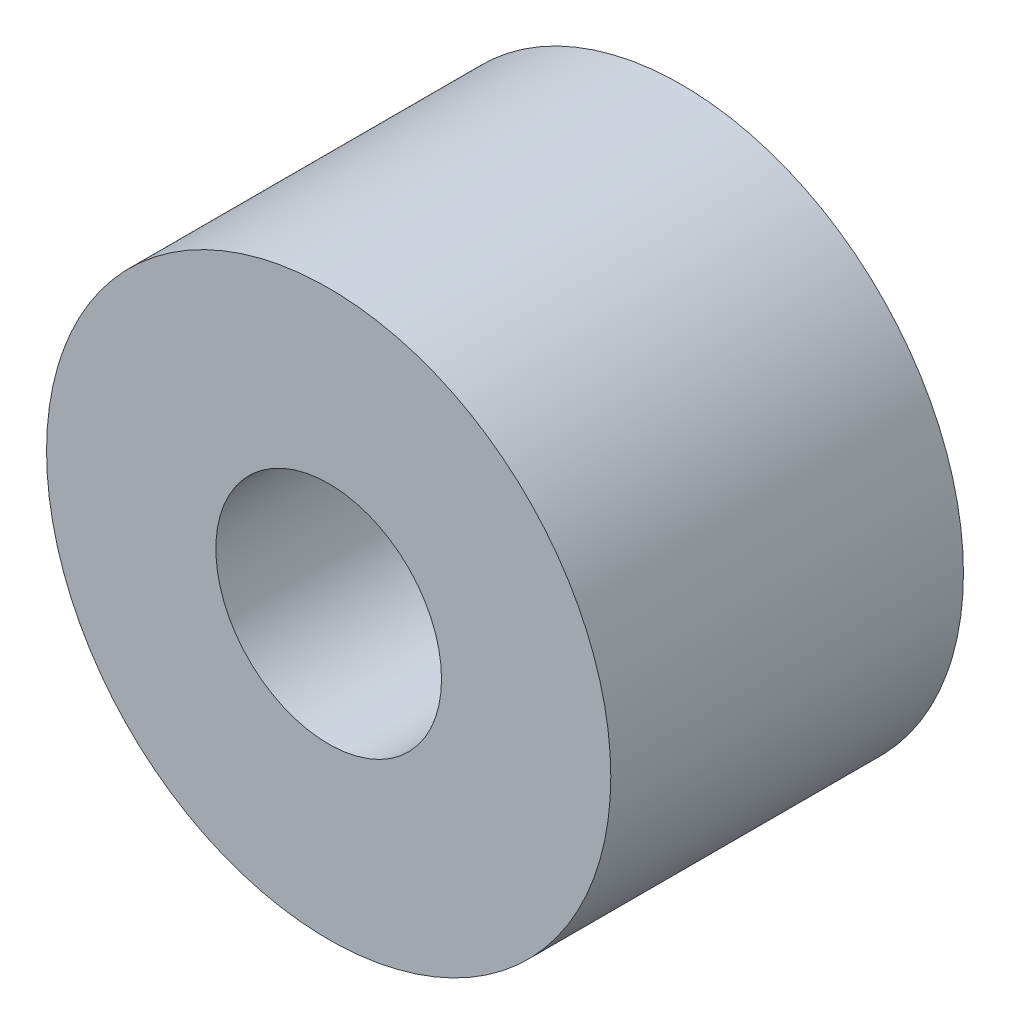
ISO-10303-21;
HEADER;
FILE_DESCRIPTION(('STEP AP214'),'2;1');
FILE_NAME('part.step','',(''),(''),'','','');
FILE_SCHEMA(('AUTOMOTIVE_DESIGN { 1 0 10303 214 1 1 1 1 }'));
ENDSEC;
DATA;
#1=APPLICATION_CONTEXT('core data for automotive mechanical design processes');
#2=APPLICATION_PROTOCOL_DEFINITION('international standard','automotive_design',2000,#1);
#3=PRODUCT_CONTEXT('',#1,'mechanical');
#4=PRODUCT('Part','Part','',(#3));
#5=PRODUCT_RELATED_PRODUCT_CATEGORY('part','',(#4));
#6=PRODUCT_DEFINITION_FORMATION('','',#4);
#7=PRODUCT_DEFINITION_CONTEXT('part definition',#1,'design');
#8=PRODUCT_DEFINITION('design','',#6,#7);
#9=PRODUCT_DEFINITION_SHAPE('','',#8);
#10=(LENGTH_UNIT() NAMED_UNIT(*) SI_UNIT(.MILLI.,.METRE.));
#11=(NAMED_UNIT(*) PLANE_ANGLE_UNIT() SI_UNIT($,.RADIAN.));
#12=(NAMED_UNIT(*) SI_UNIT($,.STERADIAN.) SOLID_ANGLE_UNIT());
#13=UNCERTAINTY_MEASURE_WITH_UNIT(LENGTH_MEASURE(1.E-05),#10,'distance_accuracy_value','');
#14=(GEOMETRIC_REPRESENTATION_CONTEXT(3) GLOBAL_UNCERTAINTY_ASSIGNED_CONTEXT((#13)) GLOBAL_UNIT_ASSIGNED_CONTEXT((#10,
#11,#12)) REPRESENTATION_CONTEXT('',''));
#15=CARTESIAN_POINT('',(0.,0.,0.));
#16=DIRECTION('',(0.,0.,1.));
#17=DIRECTION('',(1.,0.,0.));
#18=AXIS2_PLACEMENT_3D('',#15,#16,#17);
#19=CARTESIAN_POINT('',(0.,0.,2.5));
#20=DIRECTION('',(0.,0.,1.));
#21=DIRECTION('',(1.,0.,0.));
#22=AXIS2_PLACEMENT_3D('',#19,#20,#21);
#23=PLANE('',#22);
#24=CARTESIAN_POINT('',(0.,0.,2.5));
#25=DIRECTION('',(0.,0.,1.));
#26=DIRECTION('',(1.,0.,0.));
#27=AXIS2_PLACEMENT_3D('',#24,#25,#26);
#28=CIRCLE('',#27,4.);
#29=CARTESIAN_POINT('',(4.,0.,2.5));
#30=VERTEX_POINT('',#29);
#31=EDGE_CURVE('E10',#30,#30,#28,.T.);
#32=ORIENTED_EDGE('',*,*,#31,.T.);
#33=EDGE_LOOP('',(#32));
#34=FACE_BOUND('',#33,.T.);
#35=CARTESIAN_POINT('',(0.,0.,2.5));
#36=DIRECTION('',(0.,0.,1.));
#37=DIRECTION('',(1.,0.,0.));
#38=AXIS2_PLACEMENT_3D('',#35,#36,#37);
#39=CIRCLE('',#38,1.6);
#40=CARTESIAN_POINT('',(1.6,0.,2.5));
#41=VERTEX_POINT('',#40);
#42=EDGE_CURVE('E40',#41,#41,#39,.T.);
#43=ORIENTED_EDGE('',*,*,#42,.F.);
#44=EDGE_LOOP('',(#43));
#45=FACE_BOUND('',#44,.T.);
#46=ADVANCED_FACE('F33',(#34,#45),#23,.T.);
#47=CARTESIAN_POINT('',(0.,0.,2.5));
#48=DIRECTION('',(0.,0.,-1.));
#49=DIRECTION('',(-1.,0.,0.));
#50=AXIS2_PLACEMENT_3D('',#47,#48,#49);
#51=CYLINDRICAL_SURFACE('',#50,4.);
#52=ORIENTED_EDGE('',*,*,#31,.F.);
#53=EDGE_LOOP('',(#52));
#54=FACE_BOUND('',#53,.T.);
#55=CARTESIAN_POINT('',(0.,0.,-2.5));
#56=DIRECTION('',(0.,0.,1.));
#57=DIRECTION('',(1.,0.,0.));
#58=AXIS2_PLACEMENT_3D('',#55,#56,#57);
#59=CIRCLE('',#58,4.);
#60=CARTESIAN_POINT('',(4.,0.,-2.5));
#61=VERTEX_POINT('',#60);
#62=EDGE_CURVE('E44',#61,#61,#59,.T.);
#63=ORIENTED_EDGE('',*,*,#62,.T.);
#64=EDGE_LOOP('',(#63));
#65=FACE_BOUND('',#64,.T.);
#66=ADVANCED_FACE('F35',(#54,#65),#51,.T.);
#67=CARTESIAN_POINT('',(0.,0.,2.5));
#68=DIRECTION('',(0.,0.,-1.));
#69=DIRECTION('',(-1.,0.,0.));
#70=AXIS2_PLACEMENT_3D('',#67,#68,#69);
#71=CYLINDRICAL_SURFACE('',#70,1.6);
#72=ORIENTED_EDGE('',*,*,#42,.T.);
#73=EDGE_LOOP('',(#72));
#74=FACE_BOUND('',#73,.T.);
#75=CARTESIAN_POINT('',(0.,0.,-2.5));
#76=DIRECTION('',(0.,0.,1.));
#77=DIRECTION('',(1.,0.,0.));
#78=AXIS2_PLACEMENT_3D('',#75,#76,#77);
#79=CIRCLE('',#78,1.6);
#80=CARTESIAN_POINT('',(1.6,0.,-2.5));
#81=VERTEX_POINT('',#80);
#82=EDGE_CURVE('E48',#81,#81,#79,.T.);
#83=ORIENTED_EDGE('',*,*,#82,.F.);
#84=EDGE_LOOP('',(#83));
#85=FACE_BOUND('',#84,.T.);
#86=ADVANCED_FACE('F57',(#74,#85),#71,.F.);
#87=CARTESIAN_POINT('',(0.,0.,-2.5));
#88=DIRECTION('',(0.,0.,1.));
#89=DIRECTION('',(1.,0.,0.));
#90=AXIS2_PLACEMENT_3D('',#87,#88,#89);
#91=PLANE('',#90);
#92=ORIENTED_EDGE('',*,*,#82,.T.);
#93=EDGE_LOOP('',(#92));
#94=FACE_BOUND('',#93,.T.);
#95=ORIENTED_EDGE('',*,*,#62,.F.);
#96=EDGE_LOOP('',(#95));
#97=FACE_BOUND('',#96,.T.);
#98=ADVANCED_FACE('F54',(#94,#97),#91,.F.);
#99=CLOSED_SHELL('',(#46,#66,#86,#98));
#100=MANIFOLD_SOLID_BREP('B2',#99);
#101=ADVANCED_BREP_SHAPE_REPRESENTATION('',(#18,#100),#14);
#102=SHAPE_DEFINITION_REPRESENTATION(#9,#101);
ENDSEC;
END-ISO-10303-21;
